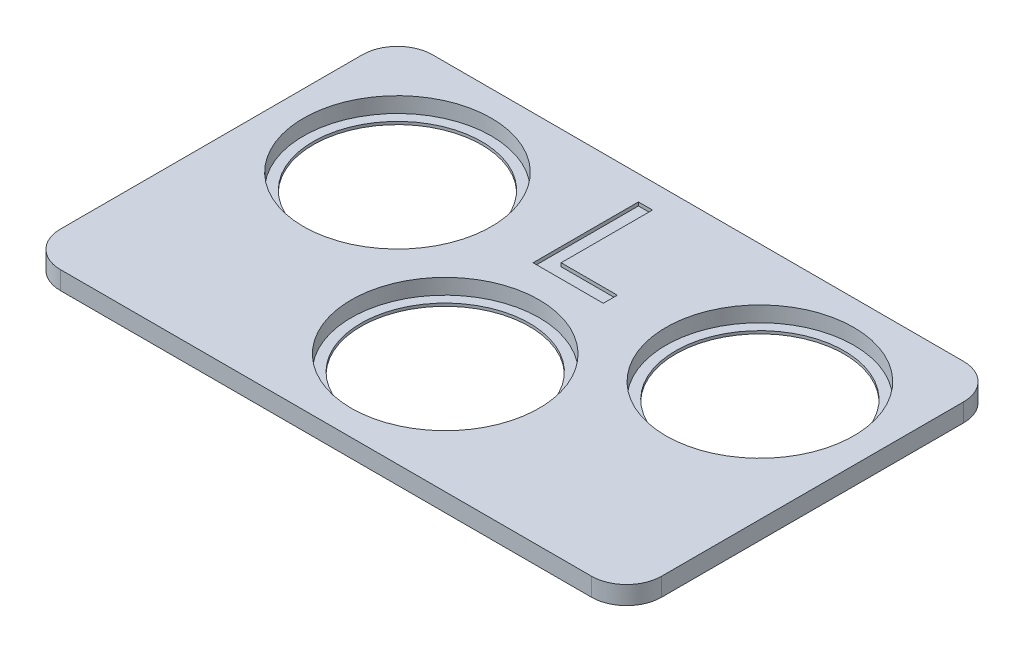
ISO-10303-21;
HEADER;
FILE_DESCRIPTION(('STEP AP214'),'2;1');
FILE_NAME('part.step','',(''),(''),'','','');
FILE_SCHEMA(('AUTOMOTIVE_DESIGN { 1 0 10303 214 1 1 1 1 }'));
ENDSEC;
DATA;
#1=APPLICATION_CONTEXT('core data for automotive mechanical design processes');
#2=APPLICATION_PROTOCOL_DEFINITION('international standard','automotive_design',2000,#1);
#3=PRODUCT_CONTEXT('',#1,'mechanical');
#4=PRODUCT('Part','Part','',(#3));
#5=PRODUCT_RELATED_PRODUCT_CATEGORY('part','',(#4));
#6=PRODUCT_DEFINITION_FORMATION('','',#4);
#7=PRODUCT_DEFINITION_CONTEXT('part definition',#1,'design');
#8=PRODUCT_DEFINITION('design','',#6,#7);
#9=PRODUCT_DEFINITION_SHAPE('','',#8);
#10=(LENGTH_UNIT() NAMED_UNIT(*) SI_UNIT(.MILLI.,.METRE.));
#11=(NAMED_UNIT(*) PLANE_ANGLE_UNIT() SI_UNIT($,.RADIAN.));
#12=(NAMED_UNIT(*) SI_UNIT($,.STERADIAN.) SOLID_ANGLE_UNIT());
#13=UNCERTAINTY_MEASURE_WITH_UNIT(LENGTH_MEASURE(1.E-05),#10,'distance_accuracy_value','');
#14=(GEOMETRIC_REPRESENTATION_CONTEXT(3) GLOBAL_UNCERTAINTY_ASSIGNED_CONTEXT((#13)) GLOBAL_UNIT_ASSIGNED_CONTEXT((#10,
#11,#12)) REPRESENTATION_CONTEXT('',''));
#15=CARTESIAN_POINT('',(0.,0.,0.));
#16=DIRECTION('',(0.,0.,1.));
#17=DIRECTION('',(1.,0.,0.));
#18=AXIS2_PLACEMENT_3D('',#15,#16,#17);
#19=CARTESIAN_POINT('',(42.8000000000002,2.6,-26.4899999999999));
#20=DIRECTION('',(-1.,0.,0.));
#21=DIRECTION('',(0.,0.,1.));
#22=AXIS2_PLACEMENT_3D('',#19,#20,#21);
#23=PLANE('',#22);
#24=DIRECTION('',(0.,0.,-1.));
#25=VECTOR('',#24,1.);
#26=CARTESIAN_POINT('',(42.8000000000002,0.,-26.4899999999999));
#27=LINE('',#26,#25);
#28=CARTESIAN_POINT('',(42.8000000000002,0.,21.4900000000001));
#29=VERTEX_POINT('',#28);
#30=CARTESIAN_POINT('',(42.8000000000002,0.,-21.4899999999999));
#31=VERTEX_POINT('',#30);
#32=EDGE_CURVE('E248',#29,#31,#27,.T.);
#33=ORIENTED_EDGE('',*,*,#32,.T.);
#34=DIRECTION('',(0.,-1.,0.));
#35=VECTOR('',#34,1.);
#36=CARTESIAN_POINT('',(42.8000000000002,2.6,-21.4899999999999));
#37=LINE('',#36,#35);
#38=CARTESIAN_POINT('',(42.8000000000002,2.6,-21.4899999999999));
#39=VERTEX_POINT('',#38);
#40=EDGE_CURVE('E314',#31,#39,#37,.F.);
#41=ORIENTED_EDGE('',*,*,#40,.T.);
#42=DIRECTION('',(0.,0.,-1.));
#43=VECTOR('',#42,1.);
#44=CARTESIAN_POINT('',(42.8000000000002,2.6,-26.4899999999999));
#45=LINE('',#44,#43);
#46=CARTESIAN_POINT('',(42.8000000000002,2.6,21.4900000000001));
#47=VERTEX_POINT('',#46);
#48=EDGE_CURVE('E252',#47,#39,#45,.T.);
#49=ORIENTED_EDGE('',*,*,#48,.F.);
#50=DIRECTION('',(0.,-1.,0.));
#51=VECTOR('',#50,1.);
#52=CARTESIAN_POINT('',(42.8000000000002,2.6,21.4900000000001));
#53=LINE('',#52,#51);
#54=EDGE_CURVE('E310',#47,#29,#53,.T.);
#55=ORIENTED_EDGE('',*,*,#54,.T.);
#56=EDGE_LOOP('',(#33,#41,#49,#55));
#57=FACE_BOUND('',#56,.T.);
#58=ADVANCED_FACE('F39',(#57),#23,.F.);
#59=CARTESIAN_POINT('',(-42.7999999999998,2.6,-26.4899999999999));
#60=DIRECTION('',(0.,0.,1.));
#61=DIRECTION('',(1.,0.,0.));
#62=AXIS2_PLACEMENT_3D('',#59,#60,#61);
#63=PLANE('',#62);
#64=DIRECTION('',(-1.,0.,0.));
#65=VECTOR('',#64,1.);
#66=CARTESIAN_POINT('',(-42.7999999999998,2.6,-26.4899999999999));
#67=LINE('',#66,#65);
#68=CARTESIAN_POINT('',(37.8000000000002,2.6,-26.4899999999999));
#69=VERTEX_POINT('',#68);
#70=CARTESIAN_POINT('',(-37.7999999999998,2.6,-26.4899999999999));
#71=VERTEX_POINT('',#70);
#72=EDGE_CURVE('E256',#69,#71,#67,.T.);
#73=ORIENTED_EDGE('',*,*,#72,.F.);
#74=DIRECTION('',(0.,-1.,0.));
#75=VECTOR('',#74,1.);
#76=CARTESIAN_POINT('',(37.8000000000002,2.6,-26.4899999999999));
#77=LINE('',#76,#75);
#78=CARTESIAN_POINT('',(37.8000000000002,0.,-26.4899999999999));
#79=VERTEX_POINT('',#78);
#80=EDGE_CURVE('E294',#69,#79,#77,.T.);
#81=ORIENTED_EDGE('',*,*,#80,.T.);
#82=DIRECTION('',(-1.,0.,0.));
#83=VECTOR('',#82,1.);
#84=CARTESIAN_POINT('',(-42.7999999999998,0.,-26.4899999999999));
#85=LINE('',#84,#83);
#86=CARTESIAN_POINT('',(-37.7999999999998,0.,-26.4899999999999));
#87=VERTEX_POINT('',#86);
#88=EDGE_CURVE('E272',#79,#87,#85,.T.);
#89=ORIENTED_EDGE('',*,*,#88,.T.);
#90=DIRECTION('',(0.,-1.,0.));
#91=VECTOR('',#90,1.);
#92=CARTESIAN_POINT('',(-37.7999999999998,2.6,-26.4899999999999));
#93=LINE('',#92,#91);
#94=EDGE_CURVE('E268',#87,#71,#93,.F.);
#95=ORIENTED_EDGE('',*,*,#94,.T.);
#96=EDGE_LOOP('',(#73,#81,#89,#95));
#97=FACE_BOUND('',#96,.T.);
#98=ADVANCED_FACE('F369',(#97),#63,.F.);
#99=CARTESIAN_POINT('',(-42.7999999999998,2.6,-26.4899999999999));
#100=DIRECTION('',(1.,0.,0.));
#101=DIRECTION('',(0.,0.,-1.));
#102=AXIS2_PLACEMENT_3D('',#99,#100,#101);
#103=PLANE('',#102);
#104=DIRECTION('',(0.,0.,1.));
#105=VECTOR('',#104,1.);
#106=CARTESIAN_POINT('',(-42.7999999999998,0.,-26.4899999999999));
#107=LINE('',#106,#105);
#108=CARTESIAN_POINT('',(-42.7999999999998,0.,-21.4899999999999));
#109=VERTEX_POINT('',#108);
#110=CARTESIAN_POINT('',(-42.7999999999998,0.,21.4900000000001));
#111=VERTEX_POINT('',#110);
#112=EDGE_CURVE('E276',#109,#111,#107,.T.);
#113=ORIENTED_EDGE('',*,*,#112,.T.);
#114=DIRECTION('',(0.,-1.,0.));
#115=VECTOR('',#114,1.);
#116=CARTESIAN_POINT('',(-42.7999999999998,2.6,21.4900000000001));
#117=LINE('',#116,#115);
#118=CARTESIAN_POINT('',(-42.7999999999998,2.6,21.4900000000001));
#119=VERTEX_POINT('',#118);
#120=EDGE_CURVE('E11',#111,#119,#117,.F.);
#121=ORIENTED_EDGE('',*,*,#120,.T.);
#122=DIRECTION('',(0.,0.,1.));
#123=VECTOR('',#122,1.);
#124=CARTESIAN_POINT('',(-42.7999999999998,2.6,-26.4899999999999));
#125=LINE('',#124,#123);
#126=CARTESIAN_POINT('',(-42.7999999999998,2.6,-21.4899999999999));
#127=VERTEX_POINT('',#126);
#128=EDGE_CURVE('E261',#127,#119,#125,.T.);
#129=ORIENTED_EDGE('',*,*,#128,.F.);
#130=DIRECTION('',(0.,-1.,0.));
#131=VECTOR('',#130,1.);
#132=CARTESIAN_POINT('',(-42.7999999999998,2.6,-21.4899999999999));
#133=LINE('',#132,#131);
#134=EDGE_CURVE('E48',#127,#109,#133,.T.);
#135=ORIENTED_EDGE('',*,*,#134,.T.);
#136=EDGE_LOOP('',(#113,#121,#129,#135));
#137=FACE_BOUND('',#136,.T.);
#138=ADVANCED_FACE('F340',(#137),#103,.F.);
#139=CARTESIAN_POINT('',(-42.7999999999998,2.6,26.4900000000001));
#140=DIRECTION('',(0.,0.,-1.));
#141=DIRECTION('',(-1.,0.,0.));
#142=AXIS2_PLACEMENT_3D('',#139,#140,#141);
#143=PLANE('',#142);
#144=DIRECTION('',(1.,0.,0.));
#145=VECTOR('',#144,1.);
#146=CARTESIAN_POINT('',(-42.7999999999998,0.,26.4900000000001));
#147=LINE('',#146,#145);
#148=CARTESIAN_POINT('',(-37.7999999999998,0.,26.4900000000001));
#149=VERTEX_POINT('',#148);
#150=CARTESIAN_POINT('',(37.8000000000002,0.,26.4900000000001));
#151=VERTEX_POINT('',#150);
#152=EDGE_CURVE('E257',#149,#151,#147,.T.);
#153=ORIENTED_EDGE('',*,*,#152,.T.);
#154=DIRECTION('',(0.,-1.,0.));
#155=VECTOR('',#154,1.);
#156=CARTESIAN_POINT('',(37.8000000000002,2.6,26.4900000000001));
#157=LINE('',#156,#155);
#158=CARTESIAN_POINT('',(37.8000000000002,2.6,26.4900000000001));
#159=VERTEX_POINT('',#158);
#160=EDGE_CURVE('E63',#151,#159,#157,.F.);
#161=ORIENTED_EDGE('',*,*,#160,.T.);
#162=DIRECTION('',(1.,0.,0.));
#163=VECTOR('',#162,1.);
#164=CARTESIAN_POINT('',(-42.7999999999998,2.6,26.4900000000001));
#165=LINE('',#164,#163);
#166=CARTESIAN_POINT('',(-37.7999999999998,2.6,26.4900000000001));
#167=VERTEX_POINT('',#166);
#168=EDGE_CURVE('E265',#167,#159,#165,.T.);
#169=ORIENTED_EDGE('',*,*,#168,.F.);
#170=DIRECTION('',(0.,-1.,0.));
#171=VECTOR('',#170,1.);
#172=CARTESIAN_POINT('',(-37.7999999999998,2.6,26.4900000000001));
#173=LINE('',#172,#171);
#174=EDGE_CURVE('E329',#167,#149,#173,.T.);
#175=ORIENTED_EDGE('',*,*,#174,.T.);
#176=EDGE_LOOP('',(#153,#161,#169,#175));
#177=FACE_BOUND('',#176,.T.);
#178=ADVANCED_FACE('F352',(#177),#143,.F.);
#179=CARTESIAN_POINT('',(0.,2.6,0.));
#180=DIRECTION('',(0.,1.,0.));
#181=DIRECTION('',(0.,0.,1.));
#182=AXIS2_PLACEMENT_3D('',#179,#180,#181);
#183=PLANE('',#182);
#184=DIRECTION('',(1.,0.,0.));
#185=VECTOR('',#184,1.);
#186=CARTESIAN_POINT('',(0.,2.6,-8.));
#187=LINE('',#186,#185);
#188=CARTESIAN_POINT('',(-5.,2.6,-8.));
#189=VERTEX_POINT('',#188);
#190=CARTESIAN_POINT('',(5.,2.6,-8.));
#191=VERTEX_POINT('',#190);
#192=EDGE_CURVE('E55',#189,#191,#187,.T.);
#193=ORIENTED_EDGE('',*,*,#192,.F.);
#194=DIRECTION('',(0.,0.,1.));
#195=VECTOR('',#194,1.);
#196=CARTESIAN_POINT('',(-5.,2.6,0.));
#197=LINE('',#196,#195);
#198=CARTESIAN_POINT('',(-5.,2.6,-23.));
#199=VERTEX_POINT('',#198);
#200=EDGE_CURVE('E166',#199,#189,#197,.T.);
#201=ORIENTED_EDGE('',*,*,#200,.F.);
#202=DIRECTION('',(1.,0.,0.));
#203=VECTOR('',#202,1.);
#204=CARTESIAN_POINT('',(0.,2.6,-23.));
#205=LINE('',#204,#203);
#206=CARTESIAN_POINT('',(-3.,2.6,-23.));
#207=VERTEX_POINT('',#206);
#208=EDGE_CURVE('E170',#199,#207,#205,.T.);
#209=ORIENTED_EDGE('',*,*,#208,.T.);
#210=DIRECTION('',(0.,0.,1.));
#211=VECTOR('',#210,1.);
#212=CARTESIAN_POINT('',(-3.,2.6,0.));
#213=LINE('',#212,#211);
#214=CARTESIAN_POINT('',(-3.,2.6,-10.));
#215=VERTEX_POINT('',#214);
#216=EDGE_CURVE('E192',#207,#215,#213,.T.);
#217=ORIENTED_EDGE('',*,*,#216,.T.);
#218=DIRECTION('',(1.,0.,0.));
#219=VECTOR('',#218,1.);
#220=CARTESIAN_POINT('',(0.,2.6,-10.));
#221=LINE('',#220,#219);
#222=CARTESIAN_POINT('',(5.,2.6,-10.));
#223=VERTEX_POINT('',#222);
#224=EDGE_CURVE('E188',#215,#223,#221,.T.);
#225=ORIENTED_EDGE('',*,*,#224,.T.);
#226=DIRECTION('',(0.,0.,-1.));
#227=VECTOR('',#226,1.);
#228=CARTESIAN_POINT('',(5.,2.6,0.));
#229=LINE('',#228,#227);
#230=EDGE_CURVE('E185',#191,#223,#229,.T.);
#231=ORIENTED_EDGE('',*,*,#230,.F.);
#232=EDGE_LOOP('',(#193,#201,#209,#217,#225,#231));
#233=FACE_BOUND('',#232,.T.);
#234=CARTESIAN_POINT('',(0.,2.6,9.51000000000009));
#235=DIRECTION('',(0.,1.,0.));
#236=DIRECTION('',(0.,0.,1.));
#237=AXIS2_PLACEMENT_3D('',#234,#235,#236);
#238=CIRCLE('',#237,13.375);
#239=CARTESIAN_POINT('',(0.,2.6,22.8850000000001));
#240=VERTEX_POINT('',#239);
#241=EDGE_CURVE('E230',#240,#240,#238,.T.);
#242=ORIENTED_EDGE('',*,*,#241,.F.);
#243=EDGE_LOOP('',(#242));
#244=FACE_BOUND('',#243,.T.);
#245=CARTESIAN_POINT('',(25.8000000000002,2.6,-9.4899999999999));
#246=DIRECTION('',(0.,1.,0.));
#247=DIRECTION('',(0.,0.,1.));
#248=AXIS2_PLACEMENT_3D('',#245,#246,#247);
#249=CIRCLE('',#248,13.375);
#250=CARTESIAN_POINT('',(25.8000000000002,2.6,3.8850000000001));
#251=VERTEX_POINT('',#250);
#252=EDGE_CURVE('E231',#251,#251,#249,.T.);
#253=ORIENTED_EDGE('',*,*,#252,.F.);
#254=EDGE_LOOP('',(#253));
#255=FACE_BOUND('',#254,.T.);
#256=CARTESIAN_POINT('',(-25.7999999999998,2.6,-9.4899999999999));
#257=DIRECTION('',(0.,1.,0.));
#258=DIRECTION('',(0.,0.,1.));
#259=AXIS2_PLACEMENT_3D('',#256,#257,#258);
#260=CIRCLE('',#259,13.375);
#261=CARTESIAN_POINT('',(-25.7999999999998,2.6,3.8850000000001));
#262=VERTEX_POINT('',#261);
#263=EDGE_CURVE('E240',#262,#262,#260,.T.);
#264=ORIENTED_EDGE('',*,*,#263,.F.);
#265=EDGE_LOOP('',(#264));
#266=FACE_BOUND('',#265,.T.);
#267=ORIENTED_EDGE('',*,*,#48,.T.);
#268=CARTESIAN_POINT('',(37.8000000000002,2.6,-21.4899999999999));
#269=DIRECTION('',(0.,1.,0.));
#270=DIRECTION('',(0.,0.,1.));
#271=AXIS2_PLACEMENT_3D('',#268,#269,#270);
#272=CIRCLE('',#271,5.);
#273=EDGE_CURVE('E326',#39,#69,#272,.T.);
#274=ORIENTED_EDGE('',*,*,#273,.T.);
#275=ORIENTED_EDGE('',*,*,#72,.T.);
#276=CARTESIAN_POINT('',(-37.7999999999998,2.6,-21.4899999999999));
#277=DIRECTION('',(0.,1.,0.));
#278=DIRECTION('',(0.,0.,1.));
#279=AXIS2_PLACEMENT_3D('',#276,#277,#278);
#280=CIRCLE('',#279,5.);
#281=EDGE_CURVE('E317',#71,#127,#280,.T.);
#282=ORIENTED_EDGE('',*,*,#281,.T.);
#283=ORIENTED_EDGE('',*,*,#128,.T.);
#284=CARTESIAN_POINT('',(-37.7999999999998,2.6,21.4900000000001));
#285=DIRECTION('',(0.,1.,0.));
#286=DIRECTION('',(0.,0.,1.));
#287=AXIS2_PLACEMENT_3D('',#284,#285,#286);
#288=CIRCLE('',#287,5.);
#289=EDGE_CURVE('E320',#119,#167,#288,.T.);
#290=ORIENTED_EDGE('',*,*,#289,.T.);
#291=ORIENTED_EDGE('',*,*,#168,.T.);
#292=CARTESIAN_POINT('',(37.8000000000002,2.6,21.4900000000001));
#293=DIRECTION('',(0.,1.,0.));
#294=DIRECTION('',(0.,0.,1.));
#295=AXIS2_PLACEMENT_3D('',#292,#293,#294);
#296=CIRCLE('',#295,5.);
#297=EDGE_CURVE('E323',#159,#47,#296,.T.);
#298=ORIENTED_EDGE('',*,*,#297,.T.);
#299=EDGE_LOOP('',(#267,#274,#275,#282,#283,#290,#291,#298));
#300=FACE_BOUND('',#299,.T.);
#301=ADVANCED_FACE('F355',(#233,#244,#255,#266,#300),#183,.T.);
#302=CARTESIAN_POINT('',(0.,0.,0.));
#303=DIRECTION('',(0.,1.,0.));
#304=DIRECTION('',(0.,0.,1.));
#305=AXIS2_PLACEMENT_3D('',#302,#303,#304);
#306=PLANE('',#305);
#307=CARTESIAN_POINT('',(-25.7999999999998,0.,-9.4899999999999));
#308=DIRECTION('',(0.,1.,0.));
#309=DIRECTION('',(0.,0.,1.));
#310=AXIS2_PLACEMENT_3D('',#307,#308,#309);
#311=CIRCLE('',#310,12.);
#312=CARTESIAN_POINT('',(-25.7999999999998,0.,2.5100000000001));
#313=VERTEX_POINT('',#312);
#314=EDGE_CURVE('E235',#313,#313,#311,.T.);
#315=ORIENTED_EDGE('',*,*,#314,.T.);
#316=EDGE_LOOP('',(#315));
#317=FACE_BOUND('',#316,.T.);
#318=CARTESIAN_POINT('',(0.,0.,9.51000000000009));
#319=DIRECTION('',(0.,1.,0.));
#320=DIRECTION('',(0.,0.,1.));
#321=AXIS2_PLACEMENT_3D('',#318,#319,#320);
#322=CIRCLE('',#321,12.);
#323=CARTESIAN_POINT('',(0.,0.,21.5100000000001));
#324=VERTEX_POINT('',#323);
#325=EDGE_CURVE('E285',#324,#324,#322,.T.);
#326=ORIENTED_EDGE('',*,*,#325,.T.);
#327=EDGE_LOOP('',(#326));
#328=FACE_BOUND('',#327,.T.);
#329=CARTESIAN_POINT('',(25.8000000000002,0.,-9.4899999999999));
#330=DIRECTION('',(0.,1.,0.));
#331=DIRECTION('',(0.,0.,1.));
#332=AXIS2_PLACEMENT_3D('',#329,#330,#331);
#333=CIRCLE('',#332,12.);
#334=CARTESIAN_POINT('',(25.8000000000002,0.,2.5100000000001));
#335=VERTEX_POINT('',#334);
#336=EDGE_CURVE('E218',#335,#335,#333,.T.);
#337=ORIENTED_EDGE('',*,*,#336,.T.);
#338=EDGE_LOOP('',(#337));
#339=FACE_BOUND('',#338,.T.);
#340=ORIENTED_EDGE('',*,*,#88,.F.);
#341=CARTESIAN_POINT('',(37.8000000000002,0.,-21.4899999999999));
#342=DIRECTION('',(0.,1.,0.));
#343=DIRECTION('',(0.,0.,1.));
#344=AXIS2_PLACEMENT_3D('',#341,#342,#343);
#345=CIRCLE('',#344,5.);
#346=EDGE_CURVE('E307',#79,#31,#345,.F.);
#347=ORIENTED_EDGE('',*,*,#346,.T.);
#348=ORIENTED_EDGE('',*,*,#32,.F.);
#349=CARTESIAN_POINT('',(37.8000000000002,0.,21.4900000000001));
#350=DIRECTION('',(0.,1.,0.));
#351=DIRECTION('',(0.,0.,1.));
#352=AXIS2_PLACEMENT_3D('',#349,#350,#351);
#353=CIRCLE('',#352,5.);
#354=EDGE_CURVE('E304',#29,#151,#353,.F.);
#355=ORIENTED_EDGE('',*,*,#354,.T.);
#356=ORIENTED_EDGE('',*,*,#152,.F.);
#357=CARTESIAN_POINT('',(-37.7999999999998,0.,21.4900000000001));
#358=DIRECTION('',(0.,1.,0.));
#359=DIRECTION('',(0.,0.,1.));
#360=AXIS2_PLACEMENT_3D('',#357,#358,#359);
#361=CIRCLE('',#360,5.);
#362=EDGE_CURVE('E301',#149,#111,#361,.F.);
#363=ORIENTED_EDGE('',*,*,#362,.T.);
#364=ORIENTED_EDGE('',*,*,#112,.F.);
#365=CARTESIAN_POINT('',(-37.7999999999998,0.,-21.4899999999999));
#366=DIRECTION('',(0.,1.,0.));
#367=DIRECTION('',(0.,0.,1.));
#368=AXIS2_PLACEMENT_3D('',#365,#366,#367);
#369=CIRCLE('',#368,5.);
#370=EDGE_CURVE('E298',#109,#87,#369,.F.);
#371=ORIENTED_EDGE('',*,*,#370,.T.);
#372=EDGE_LOOP('',(#340,#347,#348,#355,#356,#363,#364,#371));
#373=FACE_BOUND('',#372,.T.);
#374=ADVANCED_FACE('F346',(#317,#328,#339,#373),#306,.F.);
#375=CARTESIAN_POINT('',(-25.7999999999998,0.4,-9.4899999999999));
#376=DIRECTION('',(0.,1.,0.));
#377=DIRECTION('',(0.,0.,1.));
#378=AXIS2_PLACEMENT_3D('',#375,#376,#377);
#379=CYLINDRICAL_SURFACE('',#378,13.375);
#380=CARTESIAN_POINT('',(-25.7999999999998,0.4,-9.4899999999999));
#381=DIRECTION('',(0.,1.,0.));
#382=DIRECTION('',(0.,0.,1.));
#383=AXIS2_PLACEMENT_3D('',#380,#381,#382);
#384=CIRCLE('',#383,13.375);
#385=CARTESIAN_POINT('',(-25.7999999999998,0.4,3.8850000000001));
#386=VERTEX_POINT('',#385);
#387=EDGE_CURVE('E244',#386,#386,#384,.T.);
#388=ORIENTED_EDGE('',*,*,#387,.F.);
#389=EDGE_LOOP('',(#388));
#390=FACE_BOUND('',#389,.T.);
#391=ORIENTED_EDGE('',*,*,#263,.T.);
#392=EDGE_LOOP('',(#391));
#393=FACE_BOUND('',#392,.T.);
#394=ADVANCED_FACE('F513',(#390,#393),#379,.F.);
#395=CARTESIAN_POINT('',(-25.7999999999998,0.4,-9.4899999999999));
#396=DIRECTION('',(0.,1.,0.));
#397=DIRECTION('',(0.,0.,1.));
#398=AXIS2_PLACEMENT_3D('',#395,#396,#397);
#399=PLANE('',#398);
#400=CARTESIAN_POINT('',(-25.7999999999998,0.4,-9.4899999999999));
#401=DIRECTION('',(0.,1.,0.));
#402=DIRECTION('',(0.,0.,1.));
#403=AXIS2_PLACEMENT_3D('',#400,#401,#402);
#404=CIRCLE('',#403,12.);
#405=CARTESIAN_POINT('',(-25.7999999999998,0.4,2.5100000000001));
#406=VERTEX_POINT('',#405);
#407=EDGE_CURVE('E214',#406,#406,#404,.T.);
#408=ORIENTED_EDGE('',*,*,#407,.F.);
#409=EDGE_LOOP('',(#408));
#410=FACE_BOUND('',#409,.T.);
#411=ORIENTED_EDGE('',*,*,#387,.T.);
#412=EDGE_LOOP('',(#411));
#413=FACE_BOUND('',#412,.T.);
#414=ADVANCED_FACE('F503',(#410,#413),#399,.T.);
#415=CARTESIAN_POINT('',(25.8000000000002,0.4,-9.4899999999999));
#416=DIRECTION('',(0.,1.,0.));
#417=DIRECTION('',(0.,0.,1.));
#418=AXIS2_PLACEMENT_3D('',#415,#416,#417);
#419=CYLINDRICAL_SURFACE('',#418,13.375);
#420=CARTESIAN_POINT('',(25.8000000000002,0.4,-9.4899999999999));
#421=DIRECTION('',(0.,1.,0.));
#422=DIRECTION('',(0.,0.,1.));
#423=AXIS2_PLACEMENT_3D('',#420,#421,#422);
#424=CIRCLE('',#423,13.375);
#425=CARTESIAN_POINT('',(25.8000000000002,0.4,3.8850000000001));
#426=VERTEX_POINT('',#425);
#427=EDGE_CURVE('E226',#426,#426,#424,.T.);
#428=ORIENTED_EDGE('',*,*,#427,.F.);
#429=EDGE_LOOP('',(#428));
#430=FACE_BOUND('',#429,.T.);
#431=ORIENTED_EDGE('',*,*,#252,.T.);
#432=EDGE_LOOP('',(#431));
#433=FACE_BOUND('',#432,.T.);
#434=ADVANCED_FACE('F499',(#430,#433),#419,.F.);
#435=CARTESIAN_POINT('',(25.8000000000002,0.4,-9.4899999999999));
#436=DIRECTION('',(0.,1.,0.));
#437=DIRECTION('',(0.,0.,1.));
#438=AXIS2_PLACEMENT_3D('',#435,#436,#437);
#439=PLANE('',#438);
#440=CARTESIAN_POINT('',(25.8000000000002,0.4,-9.4899999999999));
#441=DIRECTION('',(0.,1.,0.));
#442=DIRECTION('',(0.,0.,1.));
#443=AXIS2_PLACEMENT_3D('',#440,#441,#442);
#444=CIRCLE('',#443,12.);
#445=CARTESIAN_POINT('',(25.8000000000002,0.4,2.5100000000001));
#446=VERTEX_POINT('',#445);
#447=EDGE_CURVE('E202',#446,#446,#444,.T.);
#448=ORIENTED_EDGE('',*,*,#447,.F.);
#449=EDGE_LOOP('',(#448));
#450=FACE_BOUND('',#449,.T.);
#451=ORIENTED_EDGE('',*,*,#427,.T.);
#452=EDGE_LOOP('',(#451));
#453=FACE_BOUND('',#452,.T.);
#454=ADVANCED_FACE('F495',(#450,#453),#439,.T.);
#455=CARTESIAN_POINT('',(0.,0.4,9.51000000000009));
#456=DIRECTION('',(0.,1.,0.));
#457=DIRECTION('',(0.,0.,1.));
#458=AXIS2_PLACEMENT_3D('',#455,#456,#457);
#459=CYLINDRICAL_SURFACE('',#458,13.375);
#460=CARTESIAN_POINT('',(0.,0.4,9.51000000000009));
#461=DIRECTION('',(0.,1.,0.));
#462=DIRECTION('',(0.,0.,1.));
#463=AXIS2_PLACEMENT_3D('',#460,#461,#462);
#464=CIRCLE('',#463,13.375);
#465=CARTESIAN_POINT('',(0.,0.4,22.8850000000001));
#466=VERTEX_POINT('',#465);
#467=EDGE_CURVE('E236',#466,#466,#464,.T.);
#468=ORIENTED_EDGE('',*,*,#467,.F.);
#469=EDGE_LOOP('',(#468));
#470=FACE_BOUND('',#469,.T.);
#471=ORIENTED_EDGE('',*,*,#241,.T.);
#472=EDGE_LOOP('',(#471));
#473=FACE_BOUND('',#472,.T.);
#474=ADVANCED_FACE('F498',(#470,#473),#459,.F.);
#475=CARTESIAN_POINT('',(0.,0.4,9.51000000000009));
#476=DIRECTION('',(0.,1.,0.));
#477=DIRECTION('',(0.,0.,1.));
#478=AXIS2_PLACEMENT_3D('',#475,#476,#477);
#479=PLANE('',#478);
#480=CARTESIAN_POINT('',(0.,0.4,9.51000000000009));
#481=DIRECTION('',(0.,1.,0.));
#482=DIRECTION('',(0.,0.,1.));
#483=AXIS2_PLACEMENT_3D('',#480,#481,#482);
#484=CIRCLE('',#483,12.);
#485=CARTESIAN_POINT('',(0.,0.4,21.5100000000001));
#486=VERTEX_POINT('',#485);
#487=EDGE_CURVE('E219',#486,#486,#484,.T.);
#488=ORIENTED_EDGE('',*,*,#487,.F.);
#489=EDGE_LOOP('',(#488));
#490=FACE_BOUND('',#489,.T.);
#491=ORIENTED_EDGE('',*,*,#467,.T.);
#492=EDGE_LOOP('',(#491));
#493=FACE_BOUND('',#492,.T.);
#494=ADVANCED_FACE('F493',(#490,#493),#479,.T.);
#495=CARTESIAN_POINT('',(25.8000000000002,-1.35,-9.4899999999999));
#496=DIRECTION('',(0.,1.,0.));
#497=DIRECTION('',(0.,0.,1.));
#498=AXIS2_PLACEMENT_3D('',#495,#496,#497);
#499=CYLINDRICAL_SURFACE('',#498,12.);
#500=ORIENTED_EDGE('',*,*,#447,.T.);
#501=EDGE_LOOP('',(#500));
#502=FACE_BOUND('',#501,.T.);
#503=ORIENTED_EDGE('',*,*,#336,.F.);
#504=EDGE_LOOP('',(#503));
#505=FACE_BOUND('',#504,.T.);
#506=ADVANCED_FACE('F489',(#502,#505),#499,.F.);
#507=CARTESIAN_POINT('',(0.,-1.35,9.51000000000009));
#508=DIRECTION('',(0.,1.,0.));
#509=DIRECTION('',(0.,0.,1.));
#510=AXIS2_PLACEMENT_3D('',#507,#508,#509);
#511=CYLINDRICAL_SURFACE('',#510,12.);
#512=ORIENTED_EDGE('',*,*,#487,.T.);
#513=EDGE_LOOP('',(#512));
#514=FACE_BOUND('',#513,.T.);
#515=ORIENTED_EDGE('',*,*,#325,.F.);
#516=EDGE_LOOP('',(#515));
#517=FACE_BOUND('',#516,.T.);
#518=ADVANCED_FACE('F485',(#514,#517),#511,.F.);
#519=CARTESIAN_POINT('',(-25.7999999999998,-1.35,-9.4899999999999));
#520=DIRECTION('',(0.,1.,0.));
#521=DIRECTION('',(0.,0.,1.));
#522=AXIS2_PLACEMENT_3D('',#519,#520,#521);
#523=CYLINDRICAL_SURFACE('',#522,12.);
#524=ORIENTED_EDGE('',*,*,#407,.T.);
#525=EDGE_LOOP('',(#524));
#526=FACE_BOUND('',#525,.T.);
#527=ORIENTED_EDGE('',*,*,#314,.F.);
#528=EDGE_LOOP('',(#527));
#529=FACE_BOUND('',#528,.T.);
#530=ADVANCED_FACE('F388',(#526,#529),#523,.F.);
#531=CARTESIAN_POINT('',(37.8000000000002,2.6,-21.4899999999999));
#532=DIRECTION('',(0.,-1.,0.));
#533=DIRECTION('',(0.,0.,-1.));
#534=AXIS2_PLACEMENT_3D('',#531,#532,#533);
#535=CYLINDRICAL_SURFACE('',#534,5.);
#536=ORIENTED_EDGE('',*,*,#273,.F.);
#537=ORIENTED_EDGE('',*,*,#40,.F.);
#538=ORIENTED_EDGE('',*,*,#346,.F.);
#539=ORIENTED_EDGE('',*,*,#80,.F.);
#540=EDGE_LOOP('',(#536,#537,#538,#539));
#541=FACE_BOUND('',#540,.T.);
#542=ADVANCED_FACE('F366',(#541),#535,.T.);
#543=CARTESIAN_POINT('',(37.8000000000002,2.6,21.4900000000001));
#544=DIRECTION('',(0.,-1.,0.));
#545=DIRECTION('',(0.,0.,-1.));
#546=AXIS2_PLACEMENT_3D('',#543,#544,#545);
#547=CYLINDRICAL_SURFACE('',#546,5.);
#548=ORIENTED_EDGE('',*,*,#297,.F.);
#549=ORIENTED_EDGE('',*,*,#160,.F.);
#550=ORIENTED_EDGE('',*,*,#354,.F.);
#551=ORIENTED_EDGE('',*,*,#54,.F.);
#552=EDGE_LOOP('',(#548,#549,#550,#551));
#553=FACE_BOUND('',#552,.T.);
#554=ADVANCED_FACE('F359',(#553),#547,.T.);
#555=CARTESIAN_POINT('',(-37.7999999999998,2.6,21.4900000000001));
#556=DIRECTION('',(0.,-1.,0.));
#557=DIRECTION('',(0.,0.,-1.));
#558=AXIS2_PLACEMENT_3D('',#555,#556,#557);
#559=CYLINDRICAL_SURFACE('',#558,5.);
#560=ORIENTED_EDGE('',*,*,#289,.F.);
#561=ORIENTED_EDGE('',*,*,#120,.F.);
#562=ORIENTED_EDGE('',*,*,#362,.F.);
#563=ORIENTED_EDGE('',*,*,#174,.F.);
#564=EDGE_LOOP('',(#560,#561,#562,#563));
#565=FACE_BOUND('',#564,.T.);
#566=ADVANCED_FACE('F351',(#565),#559,.T.);
#567=CARTESIAN_POINT('',(-37.7999999999998,2.6,-21.4899999999999));
#568=DIRECTION('',(0.,-1.,0.));
#569=DIRECTION('',(0.,0.,-1.));
#570=AXIS2_PLACEMENT_3D('',#567,#568,#569);
#571=CYLINDRICAL_SURFACE('',#570,5.);
#572=ORIENTED_EDGE('',*,*,#281,.F.);
#573=ORIENTED_EDGE('',*,*,#94,.F.);
#574=ORIENTED_EDGE('',*,*,#370,.F.);
#575=ORIENTED_EDGE('',*,*,#134,.F.);
#576=EDGE_LOOP('',(#572,#573,#574,#575));
#577=FACE_BOUND('',#576,.T.);
#578=ADVANCED_FACE('F41',(#577),#571,.T.);
#579=CARTESIAN_POINT('',(0.,2.1,-8.));
#580=DIRECTION('',(0.,0.,1.));
#581=DIRECTION('',(1.,0.,0.));
#582=AXIS2_PLACEMENT_3D('',#579,#580,#581);
#583=PLANE('',#582);
#584=ORIENTED_EDGE('',*,*,#192,.T.);
#585=DIRECTION('',(0.,1.,0.));
#586=VECTOR('',#585,1.);
#587=CARTESIAN_POINT('',(5.,2.1,-8.));
#588=LINE('',#587,#586);
#589=CARTESIAN_POINT('',(5.,2.1,-8.));
#590=VERTEX_POINT('',#589);
#591=EDGE_CURVE('E140',#590,#191,#588,.T.);
#592=ORIENTED_EDGE('',*,*,#591,.F.);
#593=DIRECTION('',(1.,0.,0.));
#594=VECTOR('',#593,1.);
#595=CARTESIAN_POINT('',(0.,2.1,-8.));
#596=LINE('',#595,#594);
#597=CARTESIAN_POINT('',(-5.,2.1,-8.));
#598=VERTEX_POINT('',#597);
#599=EDGE_CURVE('E144',#598,#590,#596,.T.);
#600=ORIENTED_EDGE('',*,*,#599,.F.);
#601=DIRECTION('',(0.,1.,0.));
#602=VECTOR('',#601,1.);
#603=CARTESIAN_POINT('',(-5.,2.1,-8.));
#604=LINE('',#603,#602);
#605=EDGE_CURVE('E199',#598,#189,#604,.T.);
#606=ORIENTED_EDGE('',*,*,#605,.T.);
#607=EDGE_LOOP('',(#584,#592,#600,#606));
#608=FACE_BOUND('',#607,.T.);
#609=ADVANCED_FACE('F142',(#608),#583,.F.);
#610=CARTESIAN_POINT('',(-5.,2.1,0.));
#611=DIRECTION('',(-1.,0.,0.));
#612=DIRECTION('',(0.,0.,1.));
#613=AXIS2_PLACEMENT_3D('',#610,#611,#612);
#614=PLANE('',#613);
#615=ORIENTED_EDGE('',*,*,#200,.T.);
#616=ORIENTED_EDGE('',*,*,#605,.F.);
#617=DIRECTION('',(0.,0.,1.));
#618=VECTOR('',#617,1.);
#619=CARTESIAN_POINT('',(-5.,2.1,0.));
#620=LINE('',#619,#618);
#621=CARTESIAN_POINT('',(-5.,2.1,-23.));
#622=VERTEX_POINT('',#621);
#623=EDGE_CURVE('E151',#622,#598,#620,.T.);
#624=ORIENTED_EDGE('',*,*,#623,.F.);
#625=DIRECTION('',(0.,1.,0.));
#626=VECTOR('',#625,1.);
#627=CARTESIAN_POINT('',(-5.,2.1,-23.));
#628=LINE('',#627,#626);
#629=EDGE_CURVE('E203',#622,#199,#628,.T.);
#630=ORIENTED_EDGE('',*,*,#629,.T.);
#631=EDGE_LOOP('',(#615,#616,#624,#630));
#632=FACE_BOUND('',#631,.T.);
#633=ADVANCED_FACE('F376',(#632),#614,.F.);
#634=CARTESIAN_POINT('',(0.,2.1,-23.));
#635=DIRECTION('',(0.,0.,1.));
#636=DIRECTION('',(1.,0.,0.));
#637=AXIS2_PLACEMENT_3D('',#634,#635,#636);
#638=PLANE('',#637);
#639=ORIENTED_EDGE('',*,*,#208,.F.);
#640=ORIENTED_EDGE('',*,*,#629,.F.);
#641=DIRECTION('',(1.,0.,0.));
#642=VECTOR('',#641,1.);
#643=CARTESIAN_POINT('',(0.,2.1,-23.));
#644=LINE('',#643,#642);
#645=CARTESIAN_POINT('',(-3.,2.1,-23.));
#646=VERTEX_POINT('',#645);
#647=EDGE_CURVE('E178',#622,#646,#644,.T.);
#648=ORIENTED_EDGE('',*,*,#647,.T.);
#649=DIRECTION('',(0.,1.,0.));
#650=VECTOR('',#649,1.);
#651=CARTESIAN_POINT('',(-3.,2.1,-23.));
#652=LINE('',#651,#650);
#653=EDGE_CURVE('E206',#646,#207,#652,.T.);
#654=ORIENTED_EDGE('',*,*,#653,.T.);
#655=EDGE_LOOP('',(#639,#640,#648,#654));
#656=FACE_BOUND('',#655,.T.);
#657=ADVANCED_FACE('F433',(#656),#638,.T.);
#658=CARTESIAN_POINT('',(-3.,2.1,0.));
#659=DIRECTION('',(-1.,0.,0.));
#660=DIRECTION('',(0.,0.,1.));
#661=AXIS2_PLACEMENT_3D('',#658,#659,#660);
#662=PLANE('',#661);
#663=ORIENTED_EDGE('',*,*,#216,.F.);
#664=ORIENTED_EDGE('',*,*,#653,.F.);
#665=DIRECTION('',(0.,0.,1.));
#666=VECTOR('',#665,1.);
#667=CARTESIAN_POINT('',(-3.,2.1,0.));
#668=LINE('',#667,#666);
#669=CARTESIAN_POINT('',(-3.,2.1,-10.));
#670=VERTEX_POINT('',#669);
#671=EDGE_CURVE('E175',#646,#670,#668,.T.);
#672=ORIENTED_EDGE('',*,*,#671,.T.);
#673=DIRECTION('',(0.,1.,0.));
#674=VECTOR('',#673,1.);
#675=CARTESIAN_POINT('',(-3.,2.1,-10.));
#676=LINE('',#675,#674);
#677=EDGE_CURVE('E209',#670,#215,#676,.T.);
#678=ORIENTED_EDGE('',*,*,#677,.T.);
#679=EDGE_LOOP('',(#663,#664,#672,#678));
#680=FACE_BOUND('',#679,.T.);
#681=ADVANCED_FACE('F443',(#680),#662,.T.);
#682=CARTESIAN_POINT('',(0.,2.1,-10.));
#683=DIRECTION('',(0.,0.,1.));
#684=DIRECTION('',(1.,0.,0.));
#685=AXIS2_PLACEMENT_3D('',#682,#683,#684);
#686=PLANE('',#685);
#687=ORIENTED_EDGE('',*,*,#224,.F.);
#688=ORIENTED_EDGE('',*,*,#677,.F.);
#689=DIRECTION('',(1.,0.,0.));
#690=VECTOR('',#689,1.);
#691=CARTESIAN_POINT('',(0.,2.1,-10.));
#692=LINE('',#691,#690);
#693=CARTESIAN_POINT('',(5.,2.1,-10.));
#694=VERTEX_POINT('',#693);
#695=EDGE_CURVE('E160',#670,#694,#692,.T.);
#696=ORIENTED_EDGE('',*,*,#695,.T.);
#697=DIRECTION('',(0.,1.,0.));
#698=VECTOR('',#697,1.);
#699=CARTESIAN_POINT('',(5.,2.1,-10.));
#700=LINE('',#699,#698);
#701=EDGE_CURVE('E150',#694,#223,#700,.T.);
#702=ORIENTED_EDGE('',*,*,#701,.T.);
#703=EDGE_LOOP('',(#687,#688,#696,#702));
#704=FACE_BOUND('',#703,.T.);
#705=ADVANCED_FACE('F453',(#704),#686,.T.);
#706=CARTESIAN_POINT('',(5.,2.1,0.));
#707=DIRECTION('',(1.,0.,0.));
#708=DIRECTION('',(0.,0.,-1.));
#709=AXIS2_PLACEMENT_3D('',#706,#707,#708);
#710=PLANE('',#709);
#711=ORIENTED_EDGE('',*,*,#230,.T.);
#712=ORIENTED_EDGE('',*,*,#701,.F.);
#713=DIRECTION('',(0.,0.,-1.));
#714=VECTOR('',#713,1.);
#715=CARTESIAN_POINT('',(5.,2.1,0.));
#716=LINE('',#715,#714);
#717=EDGE_CURVE('E155',#590,#694,#716,.T.);
#718=ORIENTED_EDGE('',*,*,#717,.F.);
#719=ORIENTED_EDGE('',*,*,#591,.T.);
#720=EDGE_LOOP('',(#711,#712,#718,#719));
#721=FACE_BOUND('',#720,.T.);
#722=ADVANCED_FACE('F156',(#721),#710,.F.);
#723=CARTESIAN_POINT('',(0.,2.1,0.));
#724=DIRECTION('',(0.,1.,0.));
#725=DIRECTION('',(0.,0.,1.));
#726=AXIS2_PLACEMENT_3D('',#723,#724,#725);
#727=PLANE('',#726);
#728=ORIENTED_EDGE('',*,*,#599,.T.);
#729=ORIENTED_EDGE('',*,*,#717,.T.);
#730=ORIENTED_EDGE('',*,*,#695,.F.);
#731=ORIENTED_EDGE('',*,*,#671,.F.);
#732=ORIENTED_EDGE('',*,*,#647,.F.);
#733=ORIENTED_EDGE('',*,*,#623,.T.);
#734=EDGE_LOOP('',(#728,#729,#730,#731,#732,#733));
#735=FACE_BOUND('',#734,.T.);
#736=ADVANCED_FACE('F162',(#735),#727,.T.);
#737=CLOSED_SHELL('',(#58,#98,#138,#178,#301,#374,#394,#414,#434,#454,#474,#494,#506,#518,#530,
#542,#554,#566,#578,#609,#633,#657,#681,#705,#722,#736));
#738=MANIFOLD_SOLID_BREP('B2',#737);
#739=ADVANCED_BREP_SHAPE_REPRESENTATION('',(#18,#738),#14);
#740=SHAPE_DEFINITION_REPRESENTATION(#9,#739);
ENDSEC;
END-ISO-10303-21;
